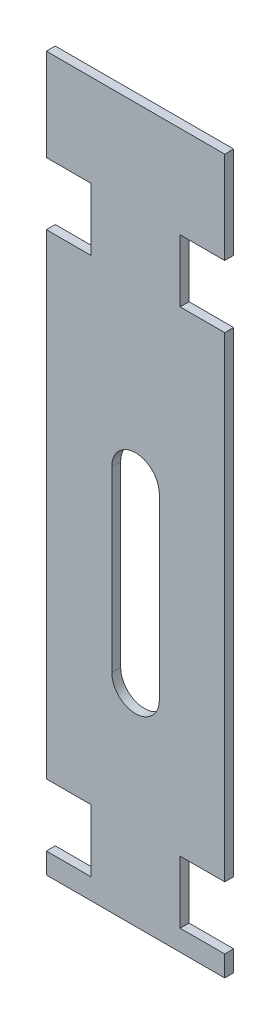
ISO-10303-21;
HEADER;
FILE_DESCRIPTION(('STEP AP214'),'2;1');
FILE_NAME('part.step','',(''),(''),'','','');
FILE_SCHEMA(('AUTOMOTIVE_DESIGN { 1 0 10303 214 1 1 1 1 }'));
ENDSEC;
DATA;
#1=APPLICATION_CONTEXT('core data for automotive mechanical design processes');
#2=APPLICATION_PROTOCOL_DEFINITION('international standard','automotive_design',2000,#1);
#3=PRODUCT_CONTEXT('',#1,'mechanical');
#4=PRODUCT('Part','Part','',(#3));
#5=PRODUCT_RELATED_PRODUCT_CATEGORY('part','',(#4));
#6=PRODUCT_DEFINITION_FORMATION('','',#4);
#7=PRODUCT_DEFINITION_CONTEXT('part definition',#1,'design');
#8=PRODUCT_DEFINITION('design','',#6,#7);
#9=PRODUCT_DEFINITION_SHAPE('','',#8);
#10=(LENGTH_UNIT() NAMED_UNIT(*) SI_UNIT(.MILLI.,.METRE.));
#11=(NAMED_UNIT(*) PLANE_ANGLE_UNIT() SI_UNIT($,.RADIAN.));
#12=(NAMED_UNIT(*) SI_UNIT($,.STERADIAN.) SOLID_ANGLE_UNIT());
#13=UNCERTAINTY_MEASURE_WITH_UNIT(LENGTH_MEASURE(1.E-05),#10,'distance_accuracy_value','');
#14=(GEOMETRIC_REPRESENTATION_CONTEXT(3) GLOBAL_UNCERTAINTY_ASSIGNED_CONTEXT((#13)) GLOBAL_UNIT_ASSIGNED_CONTEXT((#10,
#11,#12)) REPRESENTATION_CONTEXT('',''));
#15=CARTESIAN_POINT('',(0.,0.,0.));
#16=DIRECTION('',(0.,0.,1.));
#17=DIRECTION('',(1.,0.,0.));
#18=AXIS2_PLACEMENT_3D('',#15,#16,#17);
#19=CARTESIAN_POINT('',(0.,0.,3.));
#20=DIRECTION('',(1.,0.,0.));
#21=DIRECTION('',(0.,0.,-1.));
#22=AXIS2_PLACEMENT_3D('',#19,#20,#21);
#23=PLANE('',#22);
#24=DIRECTION('',(0.,-1.,0.));
#25=VECTOR('',#24,1.);
#26=CARTESIAN_POINT('',(0.,0.,3.));
#27=LINE('',#26,#25);
#28=CARTESIAN_POINT('',(0.,188.,3.));
#29=VERTEX_POINT('',#28);
#30=CARTESIAN_POINT('',(0.,28.,3.));
#31=VERTEX_POINT('',#30);
#32=EDGE_CURVE('E213',#29,#31,#27,.T.);
#33=ORIENTED_EDGE('',*,*,#32,.F.);
#34=DIRECTION('',(0.,0.,-1.));
#35=VECTOR('',#34,1.);
#36=CARTESIAN_POINT('',(0.,188.,3.));
#37=LINE('',#36,#35);
#38=CARTESIAN_POINT('',(0.,188.,0.));
#39=VERTEX_POINT('',#38);
#40=EDGE_CURVE('E370',#29,#39,#37,.T.);
#41=ORIENTED_EDGE('',*,*,#40,.T.);
#42=DIRECTION('',(0.,-1.,0.));
#43=VECTOR('',#42,1.);
#44=CARTESIAN_POINT('',(0.,0.,0.));
#45=LINE('',#44,#43);
#46=CARTESIAN_POINT('',(0.,28.,0.));
#47=VERTEX_POINT('',#46);
#48=EDGE_CURVE('E215',#39,#47,#45,.T.);
#49=ORIENTED_EDGE('',*,*,#48,.T.);
#50=DIRECTION('',(0.,0.,-1.));
#51=VECTOR('',#50,1.);
#52=CARTESIAN_POINT('',(0.,28.,3.));
#53=LINE('',#52,#51);
#54=EDGE_CURVE('E199',#31,#47,#53,.T.);
#55=ORIENTED_EDGE('',*,*,#54,.F.);
#56=EDGE_LOOP('',(#33,#41,#49,#55));
#57=FACE_BOUND('',#56,.T.);
#58=ADVANCED_FACE('F35',(#57),#23,.F.);
#59=CARTESIAN_POINT('',(0.,7.,3.));
#60=VERTEX_POINT('',#59);
#61=CARTESIAN_POINT('',(0.,0.,3.));
#62=VERTEX_POINT('',#61);
#63=EDGE_CURVE('E225',#60,#62,#27,.T.);
#64=ORIENTED_EDGE('',*,*,#63,.F.);
#65=DIRECTION('',(0.,0.,-1.));
#66=VECTOR('',#65,1.);
#67=CARTESIAN_POINT('',(0.,7.,3.));
#68=LINE('',#67,#66);
#69=CARTESIAN_POINT('',(0.,7.,0.));
#70=VERTEX_POINT('',#69);
#71=EDGE_CURVE('E281',#60,#70,#68,.T.);
#72=ORIENTED_EDGE('',*,*,#71,.T.);
#73=CARTESIAN_POINT('',(0.,0.,0.));
#74=VERTEX_POINT('',#73);
#75=EDGE_CURVE('E247',#70,#74,#45,.T.);
#76=ORIENTED_EDGE('',*,*,#75,.T.);
#77=DIRECTION('',(0.,0.,-1.));
#78=VECTOR('',#77,1.);
#79=CARTESIAN_POINT('',(0.,0.,3.));
#80=LINE('',#79,#78);
#81=EDGE_CURVE('E11',#62,#74,#80,.T.);
#82=ORIENTED_EDGE('',*,*,#81,.F.);
#83=EDGE_LOOP('',(#64,#72,#76,#82));
#84=FACE_BOUND('',#83,.T.);
#85=ADVANCED_FACE('F404',(#84),#23,.F.);
#86=CARTESIAN_POINT('',(60.,0.,3.));
#87=DIRECTION('',(-1.,0.,0.));
#88=DIRECTION('',(0.,0.,1.));
#89=AXIS2_PLACEMENT_3D('',#86,#87,#88);
#90=PLANE('',#89);
#91=DIRECTION('',(0.,1.,0.));
#92=VECTOR('',#91,1.);
#93=CARTESIAN_POINT('',(60.,0.,3.));
#94=LINE('',#93,#92);
#95=CARTESIAN_POINT('',(60.,209.,3.));
#96=VERTEX_POINT('',#95);
#97=CARTESIAN_POINT('',(60.,240.,3.));
#98=VERTEX_POINT('',#97);
#99=EDGE_CURVE('E235',#96,#98,#94,.T.);
#100=ORIENTED_EDGE('',*,*,#99,.F.);
#101=DIRECTION('',(0.,0.,-1.));
#102=VECTOR('',#101,1.);
#103=CARTESIAN_POINT('',(60.,209.,3.));
#104=LINE('',#103,#102);
#105=CARTESIAN_POINT('',(60.,209.,0.));
#106=VERTEX_POINT('',#105);
#107=EDGE_CURVE('E346',#96,#106,#104,.T.);
#108=ORIENTED_EDGE('',*,*,#107,.T.);
#109=DIRECTION('',(0.,1.,0.));
#110=VECTOR('',#109,1.);
#111=CARTESIAN_POINT('',(60.,0.,0.));
#112=LINE('',#111,#110);
#113=CARTESIAN_POINT('',(60.,240.,0.));
#114=VERTEX_POINT('',#113);
#115=EDGE_CURVE('E249',#106,#114,#112,.T.);
#116=ORIENTED_EDGE('',*,*,#115,.T.);
#117=DIRECTION('',(0.,0.,-1.));
#118=VECTOR('',#117,1.);
#119=CARTESIAN_POINT('',(60.,240.,3.));
#120=LINE('',#119,#118);
#121=EDGE_CURVE('E257',#98,#114,#120,.T.);
#122=ORIENTED_EDGE('',*,*,#121,.F.);
#123=EDGE_LOOP('',(#100,#108,#116,#122));
#124=FACE_BOUND('',#123,.T.);
#125=ADVANCED_FACE('F440',(#124),#90,.F.);
#126=CARTESIAN_POINT('',(60.,28.,0.));
#127=VERTEX_POINT('',#126);
#128=CARTESIAN_POINT('',(60.,188.,0.));
#129=VERTEX_POINT('',#128);
#130=EDGE_CURVE('E253',#127,#129,#112,.T.);
#131=ORIENTED_EDGE('',*,*,#130,.T.);
#132=DIRECTION('',(0.,0.,-1.));
#133=VECTOR('',#132,1.);
#134=CARTESIAN_POINT('',(60.,188.,3.));
#135=LINE('',#134,#133);
#136=CARTESIAN_POINT('',(60.,188.,3.));
#137=VERTEX_POINT('',#136);
#138=EDGE_CURVE('E339',#137,#129,#135,.T.);
#139=ORIENTED_EDGE('',*,*,#138,.F.);
#140=CARTESIAN_POINT('',(60.,28.,3.));
#141=VERTEX_POINT('',#140);
#142=EDGE_CURVE('E240',#141,#137,#94,.T.);
#143=ORIENTED_EDGE('',*,*,#142,.F.);
#144=DIRECTION('',(0.,0.,-1.));
#145=VECTOR('',#144,1.);
#146=CARTESIAN_POINT('',(60.,28.,3.));
#147=LINE('',#146,#145);
#148=EDGE_CURVE('E294',#141,#127,#147,.T.);
#149=ORIENTED_EDGE('',*,*,#148,.T.);
#150=EDGE_LOOP('',(#131,#139,#143,#149));
#151=FACE_BOUND('',#150,.T.);
#152=ADVANCED_FACE('F433',(#151),#90,.F.);
#153=CARTESIAN_POINT('',(0.,240.,0.));
#154=VERTEX_POINT('',#153);
#155=CARTESIAN_POINT('',(0.,209.,0.));
#156=VERTEX_POINT('',#155);
#157=EDGE_CURVE('E243',#154,#156,#45,.T.);
#158=ORIENTED_EDGE('',*,*,#157,.T.);
#159=DIRECTION('',(0.,0.,-1.));
#160=VECTOR('',#159,1.);
#161=CARTESIAN_POINT('',(0.,209.,3.));
#162=LINE('',#161,#160);
#163=CARTESIAN_POINT('',(0.,209.,3.));
#164=VERTEX_POINT('',#163);
#165=EDGE_CURVE('E364',#164,#156,#162,.T.);
#166=ORIENTED_EDGE('',*,*,#165,.F.);
#167=CARTESIAN_POINT('',(0.,240.,3.));
#168=VERTEX_POINT('',#167);
#169=EDGE_CURVE('E224',#168,#164,#27,.T.);
#170=ORIENTED_EDGE('',*,*,#169,.F.);
#171=DIRECTION('',(0.,0.,-1.));
#172=VECTOR('',#171,1.);
#173=CARTESIAN_POINT('',(0.,240.,3.));
#174=LINE('',#173,#172);
#175=EDGE_CURVE('E242',#168,#154,#174,.T.);
#176=ORIENTED_EDGE('',*,*,#175,.T.);
#177=EDGE_LOOP('',(#158,#166,#170,#176));
#178=FACE_BOUND('',#177,.T.);
#179=ADVANCED_FACE('F37',(#178),#23,.F.);
#180=CARTESIAN_POINT('',(0.,0.,3.));
#181=DIRECTION('',(0.,1.,0.));
#182=DIRECTION('',(0.,0.,1.));
#183=AXIS2_PLACEMENT_3D('',#180,#181,#182);
#184=PLANE('',#183);
#185=DIRECTION('',(1.,0.,0.));
#186=VECTOR('',#185,1.);
#187=CARTESIAN_POINT('',(0.,0.,0.));
#188=LINE('',#187,#186);
#189=CARTESIAN_POINT('',(60.,0.,0.));
#190=VERTEX_POINT('',#189);
#191=EDGE_CURVE('E246',#74,#190,#188,.T.);
#192=ORIENTED_EDGE('',*,*,#191,.T.);
#193=DIRECTION('',(0.,0.,-1.));
#194=VECTOR('',#193,1.);
#195=CARTESIAN_POINT('',(60.,0.,3.));
#196=LINE('',#195,#194);
#197=CARTESIAN_POINT('',(60.,0.,3.));
#198=VERTEX_POINT('',#197);
#199=EDGE_CURVE('E43',#198,#190,#196,.T.);
#200=ORIENTED_EDGE('',*,*,#199,.F.);
#201=DIRECTION('',(1.,0.,0.));
#202=VECTOR('',#201,1.);
#203=CARTESIAN_POINT('',(0.,0.,3.));
#204=LINE('',#203,#202);
#205=EDGE_CURVE('E228',#62,#198,#204,.T.);
#206=ORIENTED_EDGE('',*,*,#205,.F.);
#207=ORIENTED_EDGE('',*,*,#81,.T.);
#208=EDGE_LOOP('',(#192,#200,#206,#207));
#209=FACE_BOUND('',#208,.T.);
#210=ADVANCED_FACE('F449',(#209),#184,.F.);
#211=CARTESIAN_POINT('',(60.,7.,0.));
#212=VERTEX_POINT('',#211);
#213=EDGE_CURVE('E250',#190,#212,#112,.T.);
#214=ORIENTED_EDGE('',*,*,#213,.T.);
#215=DIRECTION('',(0.,0.,-1.));
#216=VECTOR('',#215,1.);
#217=CARTESIAN_POINT('',(60.,7.,3.));
#218=LINE('',#217,#216);
#219=CARTESIAN_POINT('',(60.,7.,3.));
#220=VERTEX_POINT('',#219);
#221=EDGE_CURVE('E232',#220,#212,#218,.T.);
#222=ORIENTED_EDGE('',*,*,#221,.F.);
#223=EDGE_CURVE('E236',#198,#220,#94,.T.);
#224=ORIENTED_EDGE('',*,*,#223,.F.);
#225=ORIENTED_EDGE('',*,*,#199,.T.);
#226=EDGE_LOOP('',(#214,#222,#224,#225));
#227=FACE_BOUND('',#226,.T.);
#228=ADVANCED_FACE('F264',(#227),#90,.F.);
#229=CARTESIAN_POINT('',(0.,240.,3.));
#230=DIRECTION('',(0.,-1.,0.));
#231=DIRECTION('',(0.,0.,-1.));
#232=AXIS2_PLACEMENT_3D('',#229,#230,#231);
#233=PLANE('',#232);
#234=DIRECTION('',(-1.,0.,0.));
#235=VECTOR('',#234,1.);
#236=CARTESIAN_POINT('',(0.,240.,0.));
#237=LINE('',#236,#235);
#238=EDGE_CURVE('E229',#114,#154,#237,.T.);
#239=ORIENTED_EDGE('',*,*,#238,.T.);
#240=ORIENTED_EDGE('',*,*,#175,.F.);
#241=DIRECTION('',(-1.,0.,0.));
#242=VECTOR('',#241,1.);
#243=CARTESIAN_POINT('',(0.,240.,3.));
#244=LINE('',#243,#242);
#245=EDGE_CURVE('E239',#98,#168,#244,.T.);
#246=ORIENTED_EDGE('',*,*,#245,.F.);
#247=ORIENTED_EDGE('',*,*,#121,.T.);
#248=EDGE_LOOP('',(#239,#240,#246,#247));
#249=FACE_BOUND('',#248,.T.);
#250=ADVANCED_FACE('F424',(#249),#233,.F.);
#251=CARTESIAN_POINT('',(0.,0.,3.));
#252=DIRECTION('',(0.,0.,-1.));
#253=DIRECTION('',(-1.,0.,0.));
#254=AXIS2_PLACEMENT_3D('',#251,#252,#253);
#255=PLANE('',#254);
#256=DIRECTION('',(0.,1.,0.));
#257=VECTOR('',#256,1.);
#258=CARTESIAN_POINT('',(22.,130.,3.));
#259=LINE('',#258,#257);
#260=CARTESIAN_POINT('',(22.,70.,3.));
#261=VERTEX_POINT('',#260);
#262=CARTESIAN_POINT('',(22.,130.,3.));
#263=VERTEX_POINT('',#262);
#264=EDGE_CURVE('E313',#261,#263,#259,.T.);
#265=ORIENTED_EDGE('',*,*,#264,.T.);
#266=CARTESIAN_POINT('',(30.,130.,3.));
#267=DIRECTION('',(0.,0.,-1.));
#268=DIRECTION('',(-1.,0.,0.));
#269=AXIS2_PLACEMENT_3D('',#266,#267,#268);
#270=CIRCLE('',#269,7.99999999999999);
#271=CARTESIAN_POINT('',(38.,130.,3.));
#272=VERTEX_POINT('',#271);
#273=EDGE_CURVE('E323',#263,#272,#270,.T.);
#274=ORIENTED_EDGE('',*,*,#273,.T.);
#275=DIRECTION('',(0.,-1.,0.));
#276=VECTOR('',#275,1.);
#277=CARTESIAN_POINT('',(38.,130.,3.));
#278=LINE('',#277,#276);
#279=CARTESIAN_POINT('',(38.,70.,3.));
#280=VERTEX_POINT('',#279);
#281=EDGE_CURVE('E334',#272,#280,#278,.T.);
#282=ORIENTED_EDGE('',*,*,#281,.T.);
#283=CARTESIAN_POINT('',(30.,70.,3.));
#284=DIRECTION('',(0.,0.,-1.));
#285=DIRECTION('',(-1.,0.,0.));
#286=AXIS2_PLACEMENT_3D('',#283,#284,#285);
#287=CIRCLE('',#286,7.99999999999999);
#288=EDGE_CURVE('E50',#280,#261,#287,.T.);
#289=ORIENTED_EDGE('',*,*,#288,.T.);
#290=EDGE_LOOP('',(#265,#274,#282,#289));
#291=FACE_BOUND('',#290,.T.);
#292=DIRECTION('',(0.,1.,0.));
#293=VECTOR('',#292,1.);
#294=CARTESIAN_POINT('',(45.,209.,3.));
#295=LINE('',#294,#293);
#296=CARTESIAN_POINT('',(45.,188.,3.));
#297=VERTEX_POINT('',#296);
#298=CARTESIAN_POINT('',(45.,209.,3.));
#299=VERTEX_POINT('',#298);
#300=EDGE_CURVE('E360',#297,#299,#295,.T.);
#301=ORIENTED_EDGE('',*,*,#300,.T.);
#302=DIRECTION('',(1.,0.,0.));
#303=VECTOR('',#302,1.);
#304=CARTESIAN_POINT('',(60.,209.,3.));
#305=LINE('',#304,#303);
#306=EDGE_CURVE('E342',#299,#96,#305,.T.);
#307=ORIENTED_EDGE('',*,*,#306,.T.);
#308=ORIENTED_EDGE('',*,*,#99,.T.);
#309=ORIENTED_EDGE('',*,*,#245,.T.);
#310=ORIENTED_EDGE('',*,*,#169,.T.);
#311=DIRECTION('',(1.,0.,0.));
#312=VECTOR('',#311,1.);
#313=CARTESIAN_POINT('',(0.,209.,3.));
#314=LINE('',#313,#312);
#315=CARTESIAN_POINT('',(15.,209.,3.));
#316=VERTEX_POINT('',#315);
#317=EDGE_CURVE('E375',#164,#316,#314,.T.);
#318=ORIENTED_EDGE('',*,*,#317,.T.);
#319=DIRECTION('',(0.,-1.,0.));
#320=VECTOR('',#319,1.);
#321=CARTESIAN_POINT('',(15.,209.,3.));
#322=LINE('',#321,#320);
#323=CARTESIAN_POINT('',(15.,188.,3.));
#324=VERTEX_POINT('',#323);
#325=EDGE_CURVE('E382',#316,#324,#322,.T.);
#326=ORIENTED_EDGE('',*,*,#325,.T.);
#327=DIRECTION('',(-1.,0.,0.));
#328=VECTOR('',#327,1.);
#329=CARTESIAN_POINT('',(15.,188.,3.));
#330=LINE('',#329,#328);
#331=EDGE_CURVE('E223',#324,#29,#330,.T.);
#332=ORIENTED_EDGE('',*,*,#331,.T.);
#333=ORIENTED_EDGE('',*,*,#32,.T.);
#334=DIRECTION('',(1.,0.,0.));
#335=VECTOR('',#334,1.);
#336=CARTESIAN_POINT('',(0.,28.,3.));
#337=LINE('',#336,#335);
#338=CARTESIAN_POINT('',(15.,28.,3.));
#339=VERTEX_POINT('',#338);
#340=EDGE_CURVE('E195',#31,#339,#337,.T.);
#341=ORIENTED_EDGE('',*,*,#340,.T.);
#342=DIRECTION('',(0.,-1.,0.));
#343=VECTOR('',#342,1.);
#344=CARTESIAN_POINT('',(15.,28.,3.));
#345=LINE('',#344,#343);
#346=CARTESIAN_POINT('',(15.,7.,3.));
#347=VERTEX_POINT('',#346);
#348=EDGE_CURVE('E206',#339,#347,#345,.T.);
#349=ORIENTED_EDGE('',*,*,#348,.T.);
#350=DIRECTION('',(-1.,0.,0.));
#351=VECTOR('',#350,1.);
#352=CARTESIAN_POINT('',(0.,7.,3.));
#353=LINE('',#352,#351);
#354=EDGE_CURVE('E216',#347,#60,#353,.T.);
#355=ORIENTED_EDGE('',*,*,#354,.T.);
#356=ORIENTED_EDGE('',*,*,#63,.T.);
#357=ORIENTED_EDGE('',*,*,#205,.T.);
#358=ORIENTED_EDGE('',*,*,#223,.T.);
#359=DIRECTION('',(-1.,0.,0.));
#360=VECTOR('',#359,1.);
#361=CARTESIAN_POINT('',(60.,7.,3.));
#362=LINE('',#361,#360);
#363=CARTESIAN_POINT('',(45.,7.,3.));
#364=VERTEX_POINT('',#363);
#365=EDGE_CURVE('E293',#220,#364,#362,.T.);
#366=ORIENTED_EDGE('',*,*,#365,.T.);
#367=DIRECTION('',(0.,1.,0.));
#368=VECTOR('',#367,1.);
#369=CARTESIAN_POINT('',(45.,7.,3.));
#370=LINE('',#369,#368);
#371=CARTESIAN_POINT('',(45.,28.,3.));
#372=VERTEX_POINT('',#371);
#373=EDGE_CURVE('E302',#364,#372,#370,.T.);
#374=ORIENTED_EDGE('',*,*,#373,.T.);
#375=DIRECTION('',(1.,0.,0.));
#376=VECTOR('',#375,1.);
#377=CARTESIAN_POINT('',(45.,28.,3.));
#378=LINE('',#377,#376);
#379=EDGE_CURVE('E289',#372,#141,#378,.T.);
#380=ORIENTED_EDGE('',*,*,#379,.T.);
#381=ORIENTED_EDGE('',*,*,#142,.T.);
#382=DIRECTION('',(-1.,0.,0.));
#383=VECTOR('',#382,1.);
#384=CARTESIAN_POINT('',(45.,188.,3.));
#385=LINE('',#384,#383);
#386=EDGE_CURVE('E352',#137,#297,#385,.T.);
#387=ORIENTED_EDGE('',*,*,#386,.T.);
#388=EDGE_LOOP('',(#301,#307,#308,#309,#310,#318,#326,#332,#333,#341,#349,#355,#356,#357,#358,
#366,#374,#380,#381,#387));
#389=FACE_BOUND('',#388,.T.);
#390=ADVANCED_FACE('F220',(#291,#389),#255,.F.);
#391=CARTESIAN_POINT('',(0.,0.,0.));
#392=DIRECTION('',(0.,0.,-1.));
#393=DIRECTION('',(-1.,0.,0.));
#394=AXIS2_PLACEMENT_3D('',#391,#392,#393);
#395=PLANE('',#394);
#396=CARTESIAN_POINT('',(30.,130.,0.));
#397=DIRECTION('',(0.,0.,-1.));
#398=DIRECTION('',(-1.,0.,0.));
#399=AXIS2_PLACEMENT_3D('',#396,#397,#398);
#400=CIRCLE('',#399,7.99999999999999);
#401=CARTESIAN_POINT('',(22.,130.,0.));
#402=VERTEX_POINT('',#401);
#403=CARTESIAN_POINT('',(38.,130.,0.));
#404=VERTEX_POINT('',#403);
#405=EDGE_CURVE('E58',#402,#404,#400,.T.);
#406=ORIENTED_EDGE('',*,*,#405,.F.);
#407=DIRECTION('',(0.,1.,0.));
#408=VECTOR('',#407,1.);
#409=CARTESIAN_POINT('',(22.,130.,0.));
#410=LINE('',#409,#408);
#411=CARTESIAN_POINT('',(22.,70.,0.));
#412=VERTEX_POINT('',#411);
#413=EDGE_CURVE('E320',#412,#402,#410,.T.);
#414=ORIENTED_EDGE('',*,*,#413,.F.);
#415=CARTESIAN_POINT('',(30.,70.,0.));
#416=DIRECTION('',(0.,0.,-1.));
#417=DIRECTION('',(-1.,0.,0.));
#418=AXIS2_PLACEMENT_3D('',#415,#416,#417);
#419=CIRCLE('',#418,7.99999999999999);
#420=CARTESIAN_POINT('',(38.,70.,0.));
#421=VERTEX_POINT('',#420);
#422=EDGE_CURVE('E324',#421,#412,#419,.T.);
#423=ORIENTED_EDGE('',*,*,#422,.F.);
#424=DIRECTION('',(0.,-1.,0.));
#425=VECTOR('',#424,1.);
#426=CARTESIAN_POINT('',(38.,130.,0.));
#427=LINE('',#426,#425);
#428=EDGE_CURVE('E327',#404,#421,#427,.T.);
#429=ORIENTED_EDGE('',*,*,#428,.F.);
#430=EDGE_LOOP('',(#406,#414,#423,#429));
#431=FACE_BOUND('',#430,.T.);
#432=DIRECTION('',(1.,0.,0.));
#433=VECTOR('',#432,1.);
#434=CARTESIAN_POINT('',(60.,209.,0.));
#435=LINE('',#434,#433);
#436=CARTESIAN_POINT('',(45.,209.,0.));
#437=VERTEX_POINT('',#436);
#438=EDGE_CURVE('E350',#437,#106,#435,.T.);
#439=ORIENTED_EDGE('',*,*,#438,.F.);
#440=DIRECTION('',(0.,1.,0.));
#441=VECTOR('',#440,1.);
#442=CARTESIAN_POINT('',(45.,209.,0.));
#443=LINE('',#442,#441);
#444=CARTESIAN_POINT('',(45.,188.,0.));
#445=VERTEX_POINT('',#444);
#446=EDGE_CURVE('E353',#445,#437,#443,.T.);
#447=ORIENTED_EDGE('',*,*,#446,.F.);
#448=DIRECTION('',(-1.,0.,0.));
#449=VECTOR('',#448,1.);
#450=CARTESIAN_POINT('',(45.,188.,0.));
#451=LINE('',#450,#449);
#452=EDGE_CURVE('E319',#129,#445,#451,.T.);
#453=ORIENTED_EDGE('',*,*,#452,.F.);
#454=ORIENTED_EDGE('',*,*,#130,.F.);
#455=DIRECTION('',(1.,0.,0.));
#456=VECTOR('',#455,1.);
#457=CARTESIAN_POINT('',(45.,28.,0.));
#458=LINE('',#457,#456);
#459=CARTESIAN_POINT('',(45.,28.,0.));
#460=VERTEX_POINT('',#459);
#461=EDGE_CURVE('E283',#460,#127,#458,.T.);
#462=ORIENTED_EDGE('',*,*,#461,.F.);
#463=DIRECTION('',(0.,1.,0.));
#464=VECTOR('',#463,1.);
#465=CARTESIAN_POINT('',(45.,7.,0.));
#466=LINE('',#465,#464);
#467=CARTESIAN_POINT('',(45.,7.,0.));
#468=VERTEX_POINT('',#467);
#469=EDGE_CURVE('E279',#468,#460,#466,.T.);
#470=ORIENTED_EDGE('',*,*,#469,.F.);
#471=DIRECTION('',(-1.,0.,0.));
#472=VECTOR('',#471,1.);
#473=CARTESIAN_POINT('',(60.,7.,0.));
#474=LINE('',#473,#472);
#475=EDGE_CURVE('E276',#212,#468,#474,.T.);
#476=ORIENTED_EDGE('',*,*,#475,.F.);
#477=ORIENTED_EDGE('',*,*,#213,.F.);
#478=ORIENTED_EDGE('',*,*,#191,.F.);
#479=ORIENTED_EDGE('',*,*,#75,.F.);
#480=DIRECTION('',(-1.,0.,0.));
#481=VECTOR('',#480,1.);
#482=CARTESIAN_POINT('',(0.,7.,0.));
#483=LINE('',#482,#481);
#484=CARTESIAN_POINT('',(15.,7.,0.));
#485=VERTEX_POINT('',#484);
#486=EDGE_CURVE('E207',#485,#70,#483,.T.);
#487=ORIENTED_EDGE('',*,*,#486,.F.);
#488=DIRECTION('',(0.,-1.,0.));
#489=VECTOR('',#488,1.);
#490=CARTESIAN_POINT('',(15.,28.,0.));
#491=LINE('',#490,#489);
#492=CARTESIAN_POINT('',(15.,28.,0.));
#493=VERTEX_POINT('',#492);
#494=EDGE_CURVE('E389',#493,#485,#491,.T.);
#495=ORIENTED_EDGE('',*,*,#494,.F.);
#496=DIRECTION('',(1.,0.,0.));
#497=VECTOR('',#496,1.);
#498=CARTESIAN_POINT('',(0.,28.,0.));
#499=LINE('',#498,#497);
#500=EDGE_CURVE('E372',#47,#493,#499,.T.);
#501=ORIENTED_EDGE('',*,*,#500,.F.);
#502=ORIENTED_EDGE('',*,*,#48,.F.);
#503=DIRECTION('',(-1.,0.,0.));
#504=VECTOR('',#503,1.);
#505=CARTESIAN_POINT('',(15.,188.,0.));
#506=LINE('',#505,#504);
#507=CARTESIAN_POINT('',(15.,188.,0.));
#508=VERTEX_POINT('',#507);
#509=EDGE_CURVE('E373',#508,#39,#506,.T.);
#510=ORIENTED_EDGE('',*,*,#509,.F.);
#511=DIRECTION('',(0.,-1.,0.));
#512=VECTOR('',#511,1.);
#513=CARTESIAN_POINT('',(15.,209.,0.));
#514=LINE('',#513,#512);
#515=CARTESIAN_POINT('',(15.,209.,0.));
#516=VERTEX_POINT('',#515);
#517=EDGE_CURVE('E376',#516,#508,#514,.T.);
#518=ORIENTED_EDGE('',*,*,#517,.F.);
#519=DIRECTION('',(1.,0.,0.));
#520=VECTOR('',#519,1.);
#521=CARTESIAN_POINT('',(0.,209.,0.));
#522=LINE('',#521,#520);
#523=EDGE_CURVE('E349',#156,#516,#522,.T.);
#524=ORIENTED_EDGE('',*,*,#523,.F.);
#525=ORIENTED_EDGE('',*,*,#157,.F.);
#526=ORIENTED_EDGE('',*,*,#238,.F.);
#527=ORIENTED_EDGE('',*,*,#115,.F.);
#528=EDGE_LOOP('',(#439,#447,#453,#454,#462,#470,#476,#477,#478,#479,#487,#495,#501,#502,#510,
#518,#524,#525,#526,#527));
#529=FACE_BOUND('',#528,.T.);
#530=ADVANCED_FACE('F272',(#431,#529),#395,.T.);
#531=CARTESIAN_POINT('',(45.,28.,3.));
#532=DIRECTION('',(0.,1.,0.));
#533=DIRECTION('',(-1.,0.,0.));
#534=AXIS2_PLACEMENT_3D('',#531,#532,#533);
#535=PLANE('',#534);
#536=ORIENTED_EDGE('',*,*,#461,.T.);
#537=ORIENTED_EDGE('',*,*,#148,.F.);
#538=ORIENTED_EDGE('',*,*,#379,.F.);
#539=DIRECTION('',(0.,0.,-1.));
#540=VECTOR('',#539,1.);
#541=CARTESIAN_POINT('',(45.,28.,3.));
#542=LINE('',#541,#540);
#543=EDGE_CURVE('E297',#372,#460,#542,.T.);
#544=ORIENTED_EDGE('',*,*,#543,.T.);
#545=EDGE_LOOP('',(#536,#537,#538,#544));
#546=FACE_BOUND('',#545,.T.);
#547=ADVANCED_FACE('F462',(#546),#535,.F.);
#548=CARTESIAN_POINT('',(45.,7.,3.));
#549=DIRECTION('',(-1.,0.,0.));
#550=DIRECTION('',(0.,0.,1.));
#551=AXIS2_PLACEMENT_3D('',#548,#549,#550);
#552=PLANE('',#551);
#553=ORIENTED_EDGE('',*,*,#469,.T.);
#554=ORIENTED_EDGE('',*,*,#543,.F.);
#555=ORIENTED_EDGE('',*,*,#373,.F.);
#556=DIRECTION('',(0.,0.,-1.));
#557=VECTOR('',#556,1.);
#558=CARTESIAN_POINT('',(45.,7.,3.));
#559=LINE('',#558,#557);
#560=EDGE_CURVE('E298',#364,#468,#559,.T.);
#561=ORIENTED_EDGE('',*,*,#560,.T.);
#562=EDGE_LOOP('',(#553,#554,#555,#561));
#563=FACE_BOUND('',#562,.T.);
#564=ADVANCED_FACE('F460',(#563),#552,.F.);
#565=CARTESIAN_POINT('',(60.,7.,3.));
#566=DIRECTION('',(0.,-1.,0.));
#567=DIRECTION('',(0.,0.,-1.));
#568=AXIS2_PLACEMENT_3D('',#565,#566,#567);
#569=PLANE('',#568);
#570=ORIENTED_EDGE('',*,*,#475,.T.);
#571=ORIENTED_EDGE('',*,*,#560,.F.);
#572=ORIENTED_EDGE('',*,*,#365,.F.);
#573=ORIENTED_EDGE('',*,*,#221,.T.);
#574=EDGE_LOOP('',(#570,#571,#572,#573));
#575=FACE_BOUND('',#574,.T.);
#576=ADVANCED_FACE('F459',(#575),#569,.F.);
#577=CARTESIAN_POINT('',(0.,7.,3.));
#578=DIRECTION('',(0.,-1.,0.));
#579=DIRECTION('',(1.,0.,0.));
#580=AXIS2_PLACEMENT_3D('',#577,#578,#579);
#581=PLANE('',#580);
#582=ORIENTED_EDGE('',*,*,#486,.T.);
#583=ORIENTED_EDGE('',*,*,#71,.F.);
#584=ORIENTED_EDGE('',*,*,#354,.F.);
#585=DIRECTION('',(0.,0.,-1.));
#586=VECTOR('',#585,1.);
#587=CARTESIAN_POINT('',(15.,7.,3.));
#588=LINE('',#587,#586);
#589=EDGE_CURVE('E286',#347,#485,#588,.T.);
#590=ORIENTED_EDGE('',*,*,#589,.T.);
#591=EDGE_LOOP('',(#582,#583,#584,#590));
#592=FACE_BOUND('',#591,.T.);
#593=ADVANCED_FACE('F402',(#592),#581,.F.);
#594=CARTESIAN_POINT('',(15.,28.,3.));
#595=DIRECTION('',(1.,0.,0.));
#596=DIRECTION('',(0.,1.,0.));
#597=AXIS2_PLACEMENT_3D('',#594,#595,#596);
#598=PLANE('',#597);
#599=ORIENTED_EDGE('',*,*,#494,.T.);
#600=ORIENTED_EDGE('',*,*,#589,.F.);
#601=ORIENTED_EDGE('',*,*,#348,.F.);
#602=DIRECTION('',(0.,0.,-1.));
#603=VECTOR('',#602,1.);
#604=CARTESIAN_POINT('',(15.,28.,3.));
#605=LINE('',#604,#603);
#606=EDGE_CURVE('E201',#339,#493,#605,.T.);
#607=ORIENTED_EDGE('',*,*,#606,.T.);
#608=EDGE_LOOP('',(#599,#600,#601,#607));
#609=FACE_BOUND('',#608,.T.);
#610=ADVANCED_FACE('F398',(#609),#598,.F.);
#611=CARTESIAN_POINT('',(0.,28.,3.));
#612=DIRECTION('',(0.,1.,0.));
#613=DIRECTION('',(-1.,0.,0.));
#614=AXIS2_PLACEMENT_3D('',#611,#612,#613);
#615=PLANE('',#614);
#616=ORIENTED_EDGE('',*,*,#500,.T.);
#617=ORIENTED_EDGE('',*,*,#606,.F.);
#618=ORIENTED_EDGE('',*,*,#340,.F.);
#619=ORIENTED_EDGE('',*,*,#54,.T.);
#620=EDGE_LOOP('',(#616,#617,#618,#619));
#621=FACE_BOUND('',#620,.T.);
#622=ADVANCED_FACE('F198',(#621),#615,.F.);
#623=CARTESIAN_POINT('',(15.,188.,3.));
#624=DIRECTION('',(0.,-1.,0.));
#625=DIRECTION('',(0.,0.,-1.));
#626=AXIS2_PLACEMENT_3D('',#623,#624,#625);
#627=PLANE('',#626);
#628=ORIENTED_EDGE('',*,*,#509,.T.);
#629=ORIENTED_EDGE('',*,*,#40,.F.);
#630=ORIENTED_EDGE('',*,*,#331,.F.);
#631=DIRECTION('',(0.,0.,-1.));
#632=VECTOR('',#631,1.);
#633=CARTESIAN_POINT('',(15.,188.,3.));
#634=LINE('',#633,#632);
#635=EDGE_CURVE('E368',#324,#508,#634,.T.);
#636=ORIENTED_EDGE('',*,*,#635,.T.);
#637=EDGE_LOOP('',(#628,#629,#630,#636));
#638=FACE_BOUND('',#637,.T.);
#639=ADVANCED_FACE('F410',(#638),#627,.F.);
#640=CARTESIAN_POINT('',(15.,209.,3.));
#641=DIRECTION('',(1.,0.,0.));
#642=DIRECTION('',(0.,1.,0.));
#643=AXIS2_PLACEMENT_3D('',#640,#641,#642);
#644=PLANE('',#643);
#645=ORIENTED_EDGE('',*,*,#517,.T.);
#646=ORIENTED_EDGE('',*,*,#635,.F.);
#647=ORIENTED_EDGE('',*,*,#325,.F.);
#648=DIRECTION('',(0.,0.,-1.));
#649=VECTOR('',#648,1.);
#650=CARTESIAN_POINT('',(15.,209.,3.));
#651=LINE('',#650,#649);
#652=EDGE_CURVE('E366',#316,#516,#651,.T.);
#653=ORIENTED_EDGE('',*,*,#652,.T.);
#654=EDGE_LOOP('',(#645,#646,#647,#653));
#655=FACE_BOUND('',#654,.T.);
#656=ADVANCED_FACE('F413',(#655),#644,.F.);
#657=CARTESIAN_POINT('',(0.,209.,3.));
#658=DIRECTION('',(0.,1.,0.));
#659=DIRECTION('',(0.,0.,1.));
#660=AXIS2_PLACEMENT_3D('',#657,#658,#659);
#661=PLANE('',#660);
#662=ORIENTED_EDGE('',*,*,#523,.T.);
#663=ORIENTED_EDGE('',*,*,#652,.F.);
#664=ORIENTED_EDGE('',*,*,#317,.F.);
#665=ORIENTED_EDGE('',*,*,#165,.T.);
#666=EDGE_LOOP('',(#662,#663,#664,#665));
#667=FACE_BOUND('',#666,.T.);
#668=ADVANCED_FACE('F415',(#667),#661,.F.);
#669=CARTESIAN_POINT('',(60.,209.,3.));
#670=DIRECTION('',(0.,1.,0.));
#671=DIRECTION('',(0.,0.,1.));
#672=AXIS2_PLACEMENT_3D('',#669,#670,#671);
#673=PLANE('',#672);
#674=ORIENTED_EDGE('',*,*,#438,.T.);
#675=ORIENTED_EDGE('',*,*,#107,.F.);
#676=ORIENTED_EDGE('',*,*,#306,.F.);
#677=DIRECTION('',(0.,0.,-1.));
#678=VECTOR('',#677,1.);
#679=CARTESIAN_POINT('',(45.,209.,3.));
#680=LINE('',#679,#678);
#681=EDGE_CURVE('E344',#299,#437,#680,.T.);
#682=ORIENTED_EDGE('',*,*,#681,.T.);
#683=EDGE_LOOP('',(#674,#675,#676,#682));
#684=FACE_BOUND('',#683,.T.);
#685=ADVANCED_FACE('F560',(#684),#673,.F.);
#686=CARTESIAN_POINT('',(45.,209.,3.));
#687=DIRECTION('',(-1.,0.,0.));
#688=DIRECTION('',(0.,-1.,0.));
#689=AXIS2_PLACEMENT_3D('',#686,#687,#688);
#690=PLANE('',#689);
#691=ORIENTED_EDGE('',*,*,#446,.T.);
#692=ORIENTED_EDGE('',*,*,#681,.F.);
#693=ORIENTED_EDGE('',*,*,#300,.F.);
#694=DIRECTION('',(0.,0.,-1.));
#695=VECTOR('',#694,1.);
#696=CARTESIAN_POINT('',(45.,188.,3.));
#697=LINE('',#696,#695);
#698=EDGE_CURVE('E341',#297,#445,#697,.T.);
#699=ORIENTED_EDGE('',*,*,#698,.T.);
#700=EDGE_LOOP('',(#691,#692,#693,#699));
#701=FACE_BOUND('',#700,.T.);
#702=ADVANCED_FACE('F569',(#701),#690,.F.);
#703=CARTESIAN_POINT('',(45.,188.,3.));
#704=DIRECTION('',(0.,-1.,0.));
#705=DIRECTION('',(0.,0.,-1.));
#706=AXIS2_PLACEMENT_3D('',#703,#704,#705);
#707=PLANE('',#706);
#708=ORIENTED_EDGE('',*,*,#452,.T.);
#709=ORIENTED_EDGE('',*,*,#698,.F.);
#710=ORIENTED_EDGE('',*,*,#386,.F.);
#711=ORIENTED_EDGE('',*,*,#138,.T.);
#712=EDGE_LOOP('',(#708,#709,#710,#711));
#713=FACE_BOUND('',#712,.T.);
#714=ADVANCED_FACE('F436',(#713),#707,.F.);
#715=CARTESIAN_POINT('',(30.,130.,3.));
#716=DIRECTION('',(0.,0.,-1.));
#717=DIRECTION('',(-1.,0.,0.));
#718=AXIS2_PLACEMENT_3D('',#715,#716,#717);
#719=CYLINDRICAL_SURFACE('',#718,7.99999999999999);
#720=ORIENTED_EDGE('',*,*,#405,.T.);
#721=DIRECTION('',(0.,0.,-1.));
#722=VECTOR('',#721,1.);
#723=CARTESIAN_POINT('',(38.,130.,3.));
#724=LINE('',#723,#722);
#725=EDGE_CURVE('E310',#272,#404,#724,.T.);
#726=ORIENTED_EDGE('',*,*,#725,.F.);
#727=ORIENTED_EDGE('',*,*,#273,.F.);
#728=DIRECTION('',(0.,0.,-1.));
#729=VECTOR('',#728,1.);
#730=CARTESIAN_POINT('',(22.,130.,3.));
#731=LINE('',#730,#729);
#732=EDGE_CURVE('E317',#263,#402,#731,.T.);
#733=ORIENTED_EDGE('',*,*,#732,.T.);
#734=EDGE_LOOP('',(#720,#726,#727,#733));
#735=FACE_BOUND('',#734,.T.);
#736=ADVANCED_FACE('F473',(#735),#719,.F.);
#737=CARTESIAN_POINT('',(22.,130.,3.));
#738=DIRECTION('',(-1.,0.,0.));
#739=DIRECTION('',(0.,-1.,0.));
#740=AXIS2_PLACEMENT_3D('',#737,#738,#739);
#741=PLANE('',#740);
#742=ORIENTED_EDGE('',*,*,#413,.T.);
#743=ORIENTED_EDGE('',*,*,#732,.F.);
#744=ORIENTED_EDGE('',*,*,#264,.F.);
#745=DIRECTION('',(0.,0.,-1.));
#746=VECTOR('',#745,1.);
#747=CARTESIAN_POINT('',(22.,70.,3.));
#748=LINE('',#747,#746);
#749=EDGE_CURVE('E315',#261,#412,#748,.T.);
#750=ORIENTED_EDGE('',*,*,#749,.T.);
#751=EDGE_LOOP('',(#742,#743,#744,#750));
#752=FACE_BOUND('',#751,.T.);
#753=ADVANCED_FACE('F596',(#752),#741,.F.);
#754=CARTESIAN_POINT('',(30.,70.,3.));
#755=DIRECTION('',(0.,0.,-1.));
#756=DIRECTION('',(-1.,0.,0.));
#757=AXIS2_PLACEMENT_3D('',#754,#755,#756);
#758=CYLINDRICAL_SURFACE('',#757,7.99999999999999);
#759=ORIENTED_EDGE('',*,*,#422,.T.);
#760=ORIENTED_EDGE('',*,*,#749,.F.);
#761=ORIENTED_EDGE('',*,*,#288,.F.);
#762=DIRECTION('',(0.,0.,-1.));
#763=VECTOR('',#762,1.);
#764=CARTESIAN_POINT('',(38.,70.,3.));
#765=LINE('',#764,#763);
#766=EDGE_CURVE('E312',#280,#421,#765,.T.);
#767=ORIENTED_EDGE('',*,*,#766,.T.);
#768=EDGE_LOOP('',(#759,#760,#761,#767));
#769=FACE_BOUND('',#768,.T.);
#770=ADVANCED_FACE('F604',(#769),#758,.F.);
#771=CARTESIAN_POINT('',(38.,130.,3.));
#772=DIRECTION('',(1.,0.,0.));
#773=DIRECTION('',(0.,1.,0.));
#774=AXIS2_PLACEMENT_3D('',#771,#772,#773);
#775=PLANE('',#774);
#776=ORIENTED_EDGE('',*,*,#428,.T.);
#777=ORIENTED_EDGE('',*,*,#766,.F.);
#778=ORIENTED_EDGE('',*,*,#281,.F.);
#779=ORIENTED_EDGE('',*,*,#725,.T.);
#780=EDGE_LOOP('',(#776,#777,#778,#779));
#781=FACE_BOUND('',#780,.T.);
#782=ADVANCED_FACE('F614',(#781),#775,.F.);
#783=CLOSED_SHELL('',(#58,#85,#125,#152,#179,#210,#228,#250,#390,#530,#547,#564,#576,#593,#610,
#622,#639,#656,#668,#685,#702,#714,#736,#753,#770,#782));
#784=MANIFOLD_SOLID_BREP('B2',#783);
#785=ADVANCED_BREP_SHAPE_REPRESENTATION('',(#18,#784),#14);
#786=SHAPE_DEFINITION_REPRESENTATION(#9,#785);
ENDSEC;
END-ISO-10303-21;
